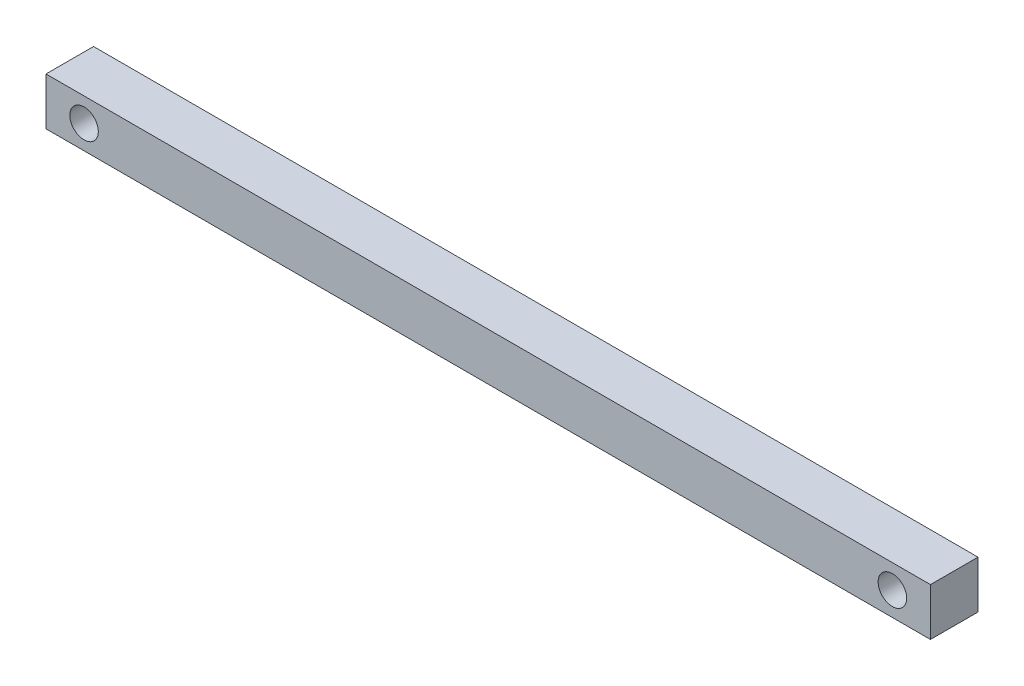
ISO-10303-21;
HEADER;
FILE_DESCRIPTION(('STEP AP214'),'2;1');
FILE_NAME('part.step','',(''),(''),'','','');
FILE_SCHEMA(('AUTOMOTIVE_DESIGN { 1 0 10303 214 1 1 1 1 }'));
ENDSEC;
DATA;
#1=APPLICATION_CONTEXT('core data for automotive mechanical design processes');
#2=APPLICATION_PROTOCOL_DEFINITION('international standard','automotive_design',2000,#1);
#3=PRODUCT_CONTEXT('',#1,'mechanical');
#4=PRODUCT('Part','Part','',(#3));
#5=PRODUCT_RELATED_PRODUCT_CATEGORY('part','',(#4));
#6=PRODUCT_DEFINITION_FORMATION('','',#4);
#7=PRODUCT_DEFINITION_CONTEXT('part definition',#1,'design');
#8=PRODUCT_DEFINITION('design','',#6,#7);
#9=PRODUCT_DEFINITION_SHAPE('','',#8);
#10=(LENGTH_UNIT() NAMED_UNIT(*) SI_UNIT(.MILLI.,.METRE.));
#11=(NAMED_UNIT(*) PLANE_ANGLE_UNIT() SI_UNIT($,.RADIAN.));
#12=(NAMED_UNIT(*) SI_UNIT($,.STERADIAN.) SOLID_ANGLE_UNIT());
#13=UNCERTAINTY_MEASURE_WITH_UNIT(LENGTH_MEASURE(1.E-05),#10,'distance_accuracy_value','');
#14=(GEOMETRIC_REPRESENTATION_CONTEXT(3) GLOBAL_UNCERTAINTY_ASSIGNED_CONTEXT((#13)) GLOBAL_UNIT_ASSIGNED_CONTEXT((#10,
#11,#12)) REPRESENTATION_CONTEXT('',''));
#15=CARTESIAN_POINT('',(0.,0.,0.));
#16=DIRECTION('',(0.,0.,1.));
#17=DIRECTION('',(1.,0.,0.));
#18=AXIS2_PLACEMENT_3D('',#15,#16,#17);
#19=CARTESIAN_POINT('',(0.,0.,25.));
#20=DIRECTION('',(0.,0.,1.));
#21=DIRECTION('',(1.,0.,0.));
#22=AXIS2_PLACEMENT_3D('',#19,#20,#21);
#23=PLANE('',#22);
#24=CARTESIAN_POINT('',(-212.5,0.,25.));
#25=DIRECTION('',(0.,0.,1.));
#26=DIRECTION('',(1.,0.,0.));
#27=AXIS2_PLACEMENT_3D('',#24,#25,#26);
#28=CIRCLE('',#27,7.50000000000001);
#29=CARTESIAN_POINT('',(-205.,0.,25.));
#30=VERTEX_POINT('',#29);
#31=EDGE_CURVE('E101',#30,#30,#28,.T.);
#32=ORIENTED_EDGE('',*,*,#31,.F.);
#33=EDGE_LOOP('',(#32));
#34=FACE_BOUND('',#33,.T.);
#35=DIRECTION('',(0.,1.,0.));
#36=VECTOR('',#35,1.);
#37=CARTESIAN_POINT('',(232.5,12.5,25.));
#38=LINE('',#37,#36);
#39=CARTESIAN_POINT('',(232.5,-12.5,25.));
#40=VERTEX_POINT('',#39);
#41=CARTESIAN_POINT('',(232.5,12.5,25.));
#42=VERTEX_POINT('',#41);
#43=EDGE_CURVE('E86',#40,#42,#38,.T.);
#44=ORIENTED_EDGE('',*,*,#43,.T.);
#45=DIRECTION('',(-1.,0.,0.));
#46=VECTOR('',#45,1.);
#47=CARTESIAN_POINT('',(-232.5,12.5,25.));
#48=LINE('',#47,#46);
#49=CARTESIAN_POINT('',(-232.5,12.5,25.));
#50=VERTEX_POINT('',#49);
#51=EDGE_CURVE('E81',#42,#50,#48,.T.);
#52=ORIENTED_EDGE('',*,*,#51,.T.);
#53=DIRECTION('',(0.,-1.,0.));
#54=VECTOR('',#53,1.);
#55=CARTESIAN_POINT('',(-232.5,12.5,25.));
#56=LINE('',#55,#54);
#57=CARTESIAN_POINT('',(-232.5,-12.5,25.));
#58=VERTEX_POINT('',#57);
#59=EDGE_CURVE('E84',#50,#58,#56,.T.);
#60=ORIENTED_EDGE('',*,*,#59,.T.);
#61=DIRECTION('',(1.,0.,0.));
#62=VECTOR('',#61,1.);
#63=CARTESIAN_POINT('',(-232.5,-12.5,25.));
#64=LINE('',#63,#62);
#65=EDGE_CURVE('E51',#58,#40,#64,.T.);
#66=ORIENTED_EDGE('',*,*,#65,.T.);
#67=EDGE_LOOP('',(#44,#52,#60,#66));
#68=FACE_BOUND('',#67,.T.);
#69=CARTESIAN_POINT('',(212.5,0.,25.));
#70=DIRECTION('',(0.,0.,1.));
#71=DIRECTION('',(1.,0.,0.));
#72=AXIS2_PLACEMENT_3D('',#69,#70,#71);
#73=CIRCLE('',#72,7.50000000000001);
#74=CARTESIAN_POINT('',(220.,0.,25.));
#75=VERTEX_POINT('',#74);
#76=EDGE_CURVE('E116',#75,#75,#73,.T.);
#77=ORIENTED_EDGE('',*,*,#76,.F.);
#78=EDGE_LOOP('',(#77));
#79=FACE_BOUND('',#78,.T.);
#80=ADVANCED_FACE('F34',(#34,#68,#79),#23,.T.);
#81=CARTESIAN_POINT('',(0.,0.,0.));
#82=DIRECTION('',(0.,0.,1.));
#83=DIRECTION('',(1.,0.,0.));
#84=AXIS2_PLACEMENT_3D('',#81,#82,#83);
#85=PLANE('',#84);
#86=DIRECTION('',(0.,1.,0.));
#87=VECTOR('',#86,1.);
#88=CARTESIAN_POINT('',(232.5,12.5,0.));
#89=LINE('',#88,#87);
#90=CARTESIAN_POINT('',(232.5,-12.5,0.));
#91=VERTEX_POINT('',#90);
#92=CARTESIAN_POINT('',(232.5,12.5,0.));
#93=VERTEX_POINT('',#92);
#94=EDGE_CURVE('E98',#91,#93,#89,.T.);
#95=ORIENTED_EDGE('',*,*,#94,.F.);
#96=DIRECTION('',(1.,0.,0.));
#97=VECTOR('',#96,1.);
#98=CARTESIAN_POINT('',(-232.5,-12.5,0.));
#99=LINE('',#98,#97);
#100=CARTESIAN_POINT('',(-232.5,-12.5,0.));
#101=VERTEX_POINT('',#100);
#102=EDGE_CURVE('E74',#101,#91,#99,.T.);
#103=ORIENTED_EDGE('',*,*,#102,.F.);
#104=DIRECTION('',(0.,-1.,0.));
#105=VECTOR('',#104,1.);
#106=CARTESIAN_POINT('',(-232.5,12.5,0.));
#107=LINE('',#106,#105);
#108=CARTESIAN_POINT('',(-232.5,12.5,0.));
#109=VERTEX_POINT('',#108);
#110=EDGE_CURVE('E68',#109,#101,#107,.T.);
#111=ORIENTED_EDGE('',*,*,#110,.F.);
#112=DIRECTION('',(-1.,0.,0.));
#113=VECTOR('',#112,1.);
#114=CARTESIAN_POINT('',(-232.5,12.5,0.));
#115=LINE('',#114,#113);
#116=EDGE_CURVE('E90',#93,#109,#115,.T.);
#117=ORIENTED_EDGE('',*,*,#116,.F.);
#118=EDGE_LOOP('',(#95,#103,#111,#117));
#119=FACE_BOUND('',#118,.T.);
#120=CARTESIAN_POINT('',(-212.5,0.,0.));
#121=DIRECTION('',(0.,0.,1.));
#122=DIRECTION('',(1.,0.,0.));
#123=AXIS2_PLACEMENT_3D('',#120,#121,#122);
#124=CIRCLE('',#123,7.50000000000001);
#125=CARTESIAN_POINT('',(-205.,0.,0.));
#126=VERTEX_POINT('',#125);
#127=EDGE_CURVE('E113',#126,#126,#124,.T.);
#128=ORIENTED_EDGE('',*,*,#127,.T.);
#129=EDGE_LOOP('',(#128));
#130=FACE_BOUND('',#129,.T.);
#131=CARTESIAN_POINT('',(212.5,0.,0.));
#132=DIRECTION('',(0.,0.,1.));
#133=DIRECTION('',(1.,0.,0.));
#134=AXIS2_PLACEMENT_3D('',#131,#132,#133);
#135=CIRCLE('',#134,7.50000000000001);
#136=CARTESIAN_POINT('',(220.,0.,0.));
#137=VERTEX_POINT('',#136);
#138=EDGE_CURVE('E119',#137,#137,#135,.T.);
#139=ORIENTED_EDGE('',*,*,#138,.T.);
#140=EDGE_LOOP('',(#139));
#141=FACE_BOUND('',#140,.T.);
#142=ADVANCED_FACE('F109',(#119,#130,#141),#85,.F.);
#143=CARTESIAN_POINT('',(232.5,12.5,25.));
#144=DIRECTION('',(-1.,0.,0.));
#145=DIRECTION('',(0.,0.,1.));
#146=AXIS2_PLACEMENT_3D('',#143,#144,#145);
#147=PLANE('',#146);
#148=ORIENTED_EDGE('',*,*,#94,.T.);
#149=DIRECTION('',(0.,0.,-1.));
#150=VECTOR('',#149,1.);
#151=CARTESIAN_POINT('',(232.5,12.5,25.));
#152=LINE('',#151,#150);
#153=EDGE_CURVE('E11',#42,#93,#152,.T.);
#154=ORIENTED_EDGE('',*,*,#153,.F.);
#155=ORIENTED_EDGE('',*,*,#43,.F.);
#156=DIRECTION('',(0.,0.,-1.));
#157=VECTOR('',#156,1.);
#158=CARTESIAN_POINT('',(232.5,-12.5,25.));
#159=LINE('',#158,#157);
#160=EDGE_CURVE('E94',#40,#91,#159,.T.);
#161=ORIENTED_EDGE('',*,*,#160,.T.);
#162=EDGE_LOOP('',(#148,#154,#155,#161));
#163=FACE_BOUND('',#162,.T.);
#164=ADVANCED_FACE('F36',(#163),#147,.F.);
#165=CARTESIAN_POINT('',(-232.5,12.5,25.));
#166=DIRECTION('',(0.,-1.,0.));
#167=DIRECTION('',(0.,0.,-1.));
#168=AXIS2_PLACEMENT_3D('',#165,#166,#167);
#169=PLANE('',#168);
#170=ORIENTED_EDGE('',*,*,#116,.T.);
#171=DIRECTION('',(0.,0.,-1.));
#172=VECTOR('',#171,1.);
#173=CARTESIAN_POINT('',(-232.5,12.5,25.));
#174=LINE('',#173,#172);
#175=EDGE_CURVE('E43',#50,#109,#174,.T.);
#176=ORIENTED_EDGE('',*,*,#175,.F.);
#177=ORIENTED_EDGE('',*,*,#51,.F.);
#178=ORIENTED_EDGE('',*,*,#153,.T.);
#179=EDGE_LOOP('',(#170,#176,#177,#178));
#180=FACE_BOUND('',#179,.T.);
#181=ADVANCED_FACE('F89',(#180),#169,.F.);
#182=CARTESIAN_POINT('',(-232.5,12.5,25.));
#183=DIRECTION('',(1.,0.,0.));
#184=DIRECTION('',(0.,0.,-1.));
#185=AXIS2_PLACEMENT_3D('',#182,#183,#184);
#186=PLANE('',#185);
#187=ORIENTED_EDGE('',*,*,#110,.T.);
#188=DIRECTION('',(0.,0.,-1.));
#189=VECTOR('',#188,1.);
#190=CARTESIAN_POINT('',(-232.5,-12.5,25.));
#191=LINE('',#190,#189);
#192=EDGE_CURVE('E91',#58,#101,#191,.T.);
#193=ORIENTED_EDGE('',*,*,#192,.F.);
#194=ORIENTED_EDGE('',*,*,#59,.F.);
#195=ORIENTED_EDGE('',*,*,#175,.T.);
#196=EDGE_LOOP('',(#187,#193,#194,#195));
#197=FACE_BOUND('',#196,.T.);
#198=ADVANCED_FACE('F92',(#197),#186,.F.);
#199=CARTESIAN_POINT('',(-232.5,-12.5,25.));
#200=DIRECTION('',(0.,1.,0.));
#201=DIRECTION('',(0.,0.,1.));
#202=AXIS2_PLACEMENT_3D('',#199,#200,#201);
#203=PLANE('',#202);
#204=ORIENTED_EDGE('',*,*,#102,.T.);
#205=ORIENTED_EDGE('',*,*,#160,.F.);
#206=ORIENTED_EDGE('',*,*,#65,.F.);
#207=ORIENTED_EDGE('',*,*,#192,.T.);
#208=EDGE_LOOP('',(#204,#205,#206,#207));
#209=FACE_BOUND('',#208,.T.);
#210=ADVANCED_FACE('F106',(#209),#203,.F.);
#211=CARTESIAN_POINT('',(-212.5,0.,25.));
#212=DIRECTION('',(0.,0.,-1.));
#213=DIRECTION('',(-1.,0.,0.));
#214=AXIS2_PLACEMENT_3D('',#211,#212,#213);
#215=CYLINDRICAL_SURFACE('',#214,7.50000000000001);
#216=ORIENTED_EDGE('',*,*,#31,.T.);
#217=EDGE_LOOP('',(#216));
#218=FACE_BOUND('',#217,.T.);
#219=ORIENTED_EDGE('',*,*,#127,.F.);
#220=EDGE_LOOP('',(#219));
#221=FACE_BOUND('',#220,.T.);
#222=ADVANCED_FACE('F136',(#218,#221),#215,.F.);
#223=CARTESIAN_POINT('',(212.5,0.,25.));
#224=DIRECTION('',(0.,0.,-1.));
#225=DIRECTION('',(-1.,0.,0.));
#226=AXIS2_PLACEMENT_3D('',#223,#224,#225);
#227=CYLINDRICAL_SURFACE('',#226,7.50000000000001);
#228=ORIENTED_EDGE('',*,*,#76,.T.);
#229=EDGE_LOOP('',(#228));
#230=FACE_BOUND('',#229,.T.);
#231=ORIENTED_EDGE('',*,*,#138,.F.);
#232=EDGE_LOOP('',(#231));
#233=FACE_BOUND('',#232,.T.);
#234=ADVANCED_FACE('F125',(#230,#233),#227,.F.);
#235=CLOSED_SHELL('',(#80,#142,#164,#181,#198,#210,#222,#234));
#236=MANIFOLD_SOLID_BREP('B2',#235);
#237=ADVANCED_BREP_SHAPE_REPRESENTATION('',(#18,#236),#14);
#238=SHAPE_DEFINITION_REPRESENTATION(#9,#237);
ENDSEC;
END-ISO-10303-21;
